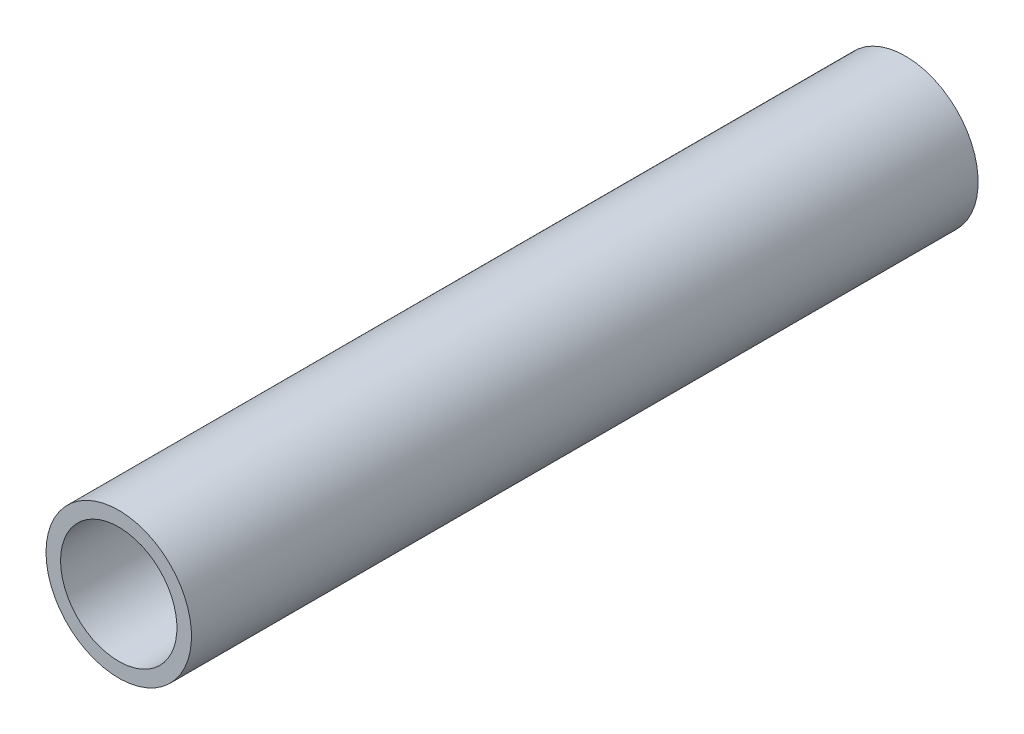
ISO-10303-21;
HEADER;
FILE_DESCRIPTION(('STEP AP214'),'2;1');
FILE_NAME('part.step','',(''),(''),'','','');
FILE_SCHEMA(('AUTOMOTIVE_DESIGN { 1 0 10303 214 1 1 1 1 }'));
ENDSEC;
DATA;
#1=APPLICATION_CONTEXT('core data for automotive mechanical design processes');
#2=APPLICATION_PROTOCOL_DEFINITION('international standard','automotive_design',2000,#1);
#3=PRODUCT_CONTEXT('',#1,'mechanical');
#4=PRODUCT('Part','Part','',(#3));
#5=PRODUCT_RELATED_PRODUCT_CATEGORY('part','',(#4));
#6=PRODUCT_DEFINITION_FORMATION('','',#4);
#7=PRODUCT_DEFINITION_CONTEXT('part definition',#1,'design');
#8=PRODUCT_DEFINITION('design','',#6,#7);
#9=PRODUCT_DEFINITION_SHAPE('','',#8);
#10=(LENGTH_UNIT() NAMED_UNIT(*) SI_UNIT(.MILLI.,.METRE.));
#11=(NAMED_UNIT(*) PLANE_ANGLE_UNIT() SI_UNIT($,.RADIAN.));
#12=(NAMED_UNIT(*) SI_UNIT($,.STERADIAN.) SOLID_ANGLE_UNIT());
#13=UNCERTAINTY_MEASURE_WITH_UNIT(LENGTH_MEASURE(1.E-05),#10,'distance_accuracy_value','');
#14=(GEOMETRIC_REPRESENTATION_CONTEXT(3) GLOBAL_UNCERTAINTY_ASSIGNED_CONTEXT((#13)) GLOBAL_UNIT_ASSIGNED_CONTEXT((#10,
#11,#12)) REPRESENTATION_CONTEXT('',''));
#15=CARTESIAN_POINT('',(0.,0.,0.));
#16=DIRECTION('',(0.,0.,1.));
#17=DIRECTION('',(1.,0.,0.));
#18=AXIS2_PLACEMENT_3D('',#15,#16,#17);
#19=CARTESIAN_POINT('',(0.,0.,13.52));
#20=DIRECTION('',(0.,0.,1.));
#21=DIRECTION('',(1.,0.,0.));
#22=AXIS2_PLACEMENT_3D('',#19,#20,#21);
#23=PLANE('',#22);
#24=CARTESIAN_POINT('',(0.,0.,13.52));
#25=DIRECTION('',(0.,0.,1.));
#26=DIRECTION('',(1.,0.,0.));
#27=AXIS2_PLACEMENT_3D('',#24,#25,#26);
#28=CIRCLE('',#27,1.25);
#29=CARTESIAN_POINT('',(-1.25,0.,13.52));
#30=VERTEX_POINT('',#29);
#31=EDGE_CURVE('E10',#30,#30,#28,.T.);
#32=ORIENTED_EDGE('',*,*,#31,.T.);
#33=EDGE_LOOP('',(#32));
#34=FACE_BOUND('',#33,.T.);
#35=CARTESIAN_POINT('',(0.,0.,13.52));
#36=DIRECTION('',(0.,0.,1.));
#37=DIRECTION('',(1.,0.,0.));
#38=AXIS2_PLACEMENT_3D('',#35,#36,#37);
#39=CIRCLE('',#38,1.);
#40=CARTESIAN_POINT('',(-1.,0.,13.52));
#41=VERTEX_POINT('',#40);
#42=EDGE_CURVE('E41',#41,#41,#39,.T.);
#43=ORIENTED_EDGE('',*,*,#42,.F.);
#44=EDGE_LOOP('',(#43));
#45=FACE_BOUND('',#44,.T.);
#46=ADVANCED_FACE('F30',(#34,#45),#23,.T.);
#47=CARTESIAN_POINT('',(0.,0.,0.));
#48=DIRECTION('',(0.,0.,1.));
#49=DIRECTION('',(1.,0.,0.));
#50=AXIS2_PLACEMENT_3D('',#47,#48,#49);
#51=PLANE('',#50);
#52=CARTESIAN_POINT('',(0.,0.,0.));
#53=DIRECTION('',(0.,0.,1.));
#54=DIRECTION('',(1.,0.,0.));
#55=AXIS2_PLACEMENT_3D('',#52,#53,#54);
#56=CIRCLE('',#55,1.25);
#57=CARTESIAN_POINT('',(-1.25,0.,0.));
#58=VERTEX_POINT('',#57);
#59=EDGE_CURVE('E34',#58,#58,#56,.T.);
#60=ORIENTED_EDGE('',*,*,#59,.F.);
#61=EDGE_LOOP('',(#60));
#62=FACE_BOUND('',#61,.T.);
#63=CARTESIAN_POINT('',(0.,0.,0.));
#64=DIRECTION('',(0.,0.,1.));
#65=DIRECTION('',(1.,0.,0.));
#66=AXIS2_PLACEMENT_3D('',#63,#64,#65);
#67=CIRCLE('',#66,1.);
#68=CARTESIAN_POINT('',(-1.,0.,0.));
#69=VERTEX_POINT('',#68);
#70=EDGE_CURVE('E43',#69,#69,#67,.T.);
#71=ORIENTED_EDGE('',*,*,#70,.T.);
#72=EDGE_LOOP('',(#71));
#73=FACE_BOUND('',#72,.T.);
#74=ADVANCED_FACE('F53',(#62,#73),#51,.F.);
#75=CARTESIAN_POINT('',(0.,0.,13.52));
#76=DIRECTION('',(0.,0.,-1.));
#77=DIRECTION('',(-1.,0.,0.));
#78=AXIS2_PLACEMENT_3D('',#75,#76,#77);
#79=CYLINDRICAL_SURFACE('',#78,1.25);
#80=CARTESIAN_POINT('',(-1.25,0.,13.52));
#81=CARTESIAN_POINT('',(-1.25,0.,13.3791666666667));
#82=CARTESIAN_POINT('',(-1.25,0.,13.2383333333333));
#83=CARTESIAN_POINT('',(-1.25,0.,12.9566666666667));
#84=CARTESIAN_POINT('',(-1.25,0.,12.8158333333333));
#85=CARTESIAN_POINT('',(-1.25,0.,12.5341666666667));
#86=CARTESIAN_POINT('',(-1.25,0.,12.3933333333333));
#87=CARTESIAN_POINT('',(-1.25,0.,12.1116666666667));
#88=CARTESIAN_POINT('',(-1.25,0.,11.9708333333333));
#89=CARTESIAN_POINT('',(-1.25,0.,11.6891666666667));
#90=CARTESIAN_POINT('',(-1.25,0.,11.5483333333333));
#91=CARTESIAN_POINT('',(-1.25,0.,11.2666666666667));
#92=CARTESIAN_POINT('',(-1.25,0.,11.1258333333333));
#93=CARTESIAN_POINT('',(-1.25,0.,10.8441666666667));
#94=CARTESIAN_POINT('',(-1.25,0.,10.7033333333333));
#95=CARTESIAN_POINT('',(-1.25,0.,10.4216666666667));
#96=CARTESIAN_POINT('',(-1.25,0.,10.2808333333333));
#97=CARTESIAN_POINT('',(-1.25,0.,9.99916666666667));
#98=CARTESIAN_POINT('',(-1.25,0.,9.85833333333333));
#99=CARTESIAN_POINT('',(-1.25,0.,9.57666666666667));
#100=CARTESIAN_POINT('',(-1.25,0.,9.43583333333333));
#101=CARTESIAN_POINT('',(-1.25,0.,9.15416666666667));
#102=CARTESIAN_POINT('',(-1.25,0.,9.01333333333333));
#103=CARTESIAN_POINT('',(-1.25,0.,8.73166666666667));
#104=CARTESIAN_POINT('',(-1.25,0.,8.59083333333333));
#105=CARTESIAN_POINT('',(-1.25,0.,8.30916666666667));
#106=CARTESIAN_POINT('',(-1.25,0.,8.16833333333333));
#107=CARTESIAN_POINT('',(-1.25,0.,7.88666666666667));
#108=CARTESIAN_POINT('',(-1.25,0.,7.74583333333333));
#109=CARTESIAN_POINT('',(-1.25,0.,7.46416666666667));
#110=CARTESIAN_POINT('',(-1.25,0.,7.32333333333333));
#111=CARTESIAN_POINT('',(-1.25,0.,7.04166666666667));
#112=CARTESIAN_POINT('',(-1.25,0.,6.90083333333333));
#113=CARTESIAN_POINT('',(-1.25,0.,6.61916666666667));
#114=CARTESIAN_POINT('',(-1.25,0.,6.47833333333333));
#115=CARTESIAN_POINT('',(-1.25,0.,6.19666666666667));
#116=CARTESIAN_POINT('',(-1.25,0.,6.05583333333333));
#117=CARTESIAN_POINT('',(-1.25,0.,5.77416666666667));
#118=CARTESIAN_POINT('',(-1.25,0.,5.63333333333333));
#119=CARTESIAN_POINT('',(-1.25,0.,5.35166666666667));
#120=CARTESIAN_POINT('',(-1.25,0.,5.21083333333333));
#121=CARTESIAN_POINT('',(-1.25,0.,4.92916666666667));
#122=CARTESIAN_POINT('',(-1.25,0.,4.78833333333333));
#123=CARTESIAN_POINT('',(-1.25,0.,4.50666666666667));
#124=CARTESIAN_POINT('',(-1.25,0.,4.36583333333333));
#125=CARTESIAN_POINT('',(-1.25,0.,4.08416666666667));
#126=CARTESIAN_POINT('',(-1.25,0.,3.94333333333333));
#127=CARTESIAN_POINT('',(-1.25,0.,3.66166666666667));
#128=CARTESIAN_POINT('',(-1.25,0.,3.52083333333333));
#129=CARTESIAN_POINT('',(-1.25,0.,3.23916666666667));
#130=CARTESIAN_POINT('',(-1.25,0.,3.09833333333333));
#131=CARTESIAN_POINT('',(-1.25,0.,2.81666666666667));
#132=CARTESIAN_POINT('',(-1.25,0.,2.67583333333333));
#133=CARTESIAN_POINT('',(-1.25,0.,2.39416666666667));
#134=CARTESIAN_POINT('',(-1.25,0.,2.25333333333333));
#135=CARTESIAN_POINT('',(-1.25,0.,1.97166666666667));
#136=CARTESIAN_POINT('',(-1.25,0.,1.83083333333333));
#137=CARTESIAN_POINT('',(-1.25,0.,1.54916666666667));
#138=CARTESIAN_POINT('',(-1.25,0.,1.40833333333333));
#139=CARTESIAN_POINT('',(-1.25,0.,1.12666666666667));
#140=CARTESIAN_POINT('',(-1.25,0.,0.985833333333333));
#141=CARTESIAN_POINT('',(-1.25,0.,0.704166666666667));
#142=CARTESIAN_POINT('',(-1.25,0.,0.563333333333333));
#143=CARTESIAN_POINT('',(-1.25,0.,0.281666666666666));
#144=CARTESIAN_POINT('',(-1.25,0.,0.140833333333333));
#145=CARTESIAN_POINT('',(-1.25,0.,0.));
#146=B_SPLINE_CURVE_WITH_KNOTS('',3,(#80,#81,#82,#83,#84,#85,#86,#87,#88,#89,#90,#91,#92,#93,
#94,#95,#96,#97,#98,#99,#100,#101,#102,#103,#104,#105,#106,#107,#108,#109,#110,#111,#112,#113,
#114,#115,#116,#117,#118,#119,#120,#121,#122,#123,#124,#125,#126,#127,#128,#129,#130,#131,#132,
#133,#134,#135,#136,#137,#138,#139,#140,#141,#142,#143,#144,#145),.UNSPECIFIED.,.F.,.F.,(4,2,2,
2,2,2,2,2,2,2,2,2,2,2,2,2,2,2,2,2,2,2,2,2,2,2,2,2,2,2,2,2,4),(0.,0.422499999999999,
0.844999999999999,1.2675,1.69,2.1125,2.535,2.9575,3.38,3.8025,4.225,4.6475,5.07,5.4925,5.915,
6.3375,6.76,7.1825,7.605,8.0275,8.45,8.8725,9.295,9.7175,10.14,10.5625,10.985,11.4075,11.83,
12.2525,12.675,13.0975,13.52),.UNSPECIFIED.);
#147=EDGE_CURVE('BSEAM32',#30,#58,#146,.T.);
#148=ORIENTED_EDGE('',*,*,#31,.F.);
#149=ORIENTED_EDGE('',*,*,#59,.T.);
#150=ORIENTED_EDGE('',*,*,#147,.T.);
#151=ORIENTED_EDGE('',*,*,#147,.F.);
#152=EDGE_LOOP('',(#148,#150,#149,#151));
#153=FACE_BOUND('',#152,.T.);
#154=ADVANCED_FACE('F32',(#153),#79,.T.);
#155=CARTESIAN_POINT('',(0.,0.,13.52));
#156=DIRECTION('',(0.,0.,-1.));
#157=DIRECTION('',(-1.,0.,0.));
#158=AXIS2_PLACEMENT_3D('',#155,#156,#157);
#159=CYLINDRICAL_SURFACE('',#158,1.);
#160=CARTESIAN_POINT('',(-1.,0.,13.52));
#161=CARTESIAN_POINT('',(-1.,0.,13.3791666666667));
#162=CARTESIAN_POINT('',(-1.,0.,13.2383333333333));
#163=CARTESIAN_POINT('',(-1.,0.,12.9566666666667));
#164=CARTESIAN_POINT('',(-1.,0.,12.8158333333333));
#165=CARTESIAN_POINT('',(-1.,0.,12.5341666666667));
#166=CARTESIAN_POINT('',(-1.,0.,12.3933333333333));
#167=CARTESIAN_POINT('',(-1.,0.,12.1116666666667));
#168=CARTESIAN_POINT('',(-1.,0.,11.9708333333333));
#169=CARTESIAN_POINT('',(-1.,0.,11.6891666666667));
#170=CARTESIAN_POINT('',(-1.,0.,11.5483333333333));
#171=CARTESIAN_POINT('',(-1.,0.,11.2666666666667));
#172=CARTESIAN_POINT('',(-1.,0.,11.1258333333333));
#173=CARTESIAN_POINT('',(-1.,0.,10.8441666666667));
#174=CARTESIAN_POINT('',(-1.,0.,10.7033333333333));
#175=CARTESIAN_POINT('',(-1.,0.,10.4216666666667));
#176=CARTESIAN_POINT('',(-1.,0.,10.2808333333333));
#177=CARTESIAN_POINT('',(-1.,0.,9.99916666666667));
#178=CARTESIAN_POINT('',(-1.,0.,9.85833333333333));
#179=CARTESIAN_POINT('',(-1.,0.,9.57666666666667));
#180=CARTESIAN_POINT('',(-1.,0.,9.43583333333333));
#181=CARTESIAN_POINT('',(-1.,0.,9.15416666666667));
#182=CARTESIAN_POINT('',(-1.,0.,9.01333333333333));
#183=CARTESIAN_POINT('',(-1.,0.,8.73166666666667));
#184=CARTESIAN_POINT('',(-1.,0.,8.59083333333333));
#185=CARTESIAN_POINT('',(-1.,0.,8.30916666666667));
#186=CARTESIAN_POINT('',(-1.,0.,8.16833333333333));
#187=CARTESIAN_POINT('',(-1.,0.,7.88666666666667));
#188=CARTESIAN_POINT('',(-1.,0.,7.74583333333333));
#189=CARTESIAN_POINT('',(-1.,0.,7.46416666666667));
#190=CARTESIAN_POINT('',(-1.,0.,7.32333333333333));
#191=CARTESIAN_POINT('',(-1.,0.,7.04166666666667));
#192=CARTESIAN_POINT('',(-1.,0.,6.90083333333333));
#193=CARTESIAN_POINT('',(-1.,0.,6.61916666666667));
#194=CARTESIAN_POINT('',(-1.,0.,6.47833333333333));
#195=CARTESIAN_POINT('',(-1.,0.,6.19666666666667));
#196=CARTESIAN_POINT('',(-1.,0.,6.05583333333333));
#197=CARTESIAN_POINT('',(-1.,0.,5.77416666666667));
#198=CARTESIAN_POINT('',(-1.,0.,5.63333333333333));
#199=CARTESIAN_POINT('',(-1.,0.,5.35166666666667));
#200=CARTESIAN_POINT('',(-1.,0.,5.21083333333333));
#201=CARTESIAN_POINT('',(-1.,0.,4.92916666666667));
#202=CARTESIAN_POINT('',(-1.,0.,4.78833333333333));
#203=CARTESIAN_POINT('',(-1.,0.,4.50666666666667));
#204=CARTESIAN_POINT('',(-1.,0.,4.36583333333333));
#205=CARTESIAN_POINT('',(-1.,0.,4.08416666666667));
#206=CARTESIAN_POINT('',(-1.,0.,3.94333333333333));
#207=CARTESIAN_POINT('',(-1.,0.,3.66166666666667));
#208=CARTESIAN_POINT('',(-1.,0.,3.52083333333333));
#209=CARTESIAN_POINT('',(-1.,0.,3.23916666666667));
#210=CARTESIAN_POINT('',(-1.,0.,3.09833333333333));
#211=CARTESIAN_POINT('',(-1.,0.,2.81666666666667));
#212=CARTESIAN_POINT('',(-1.,0.,2.67583333333333));
#213=CARTESIAN_POINT('',(-1.,0.,2.39416666666667));
#214=CARTESIAN_POINT('',(-1.,0.,2.25333333333333));
#215=CARTESIAN_POINT('',(-1.,0.,1.97166666666667));
#216=CARTESIAN_POINT('',(-1.,0.,1.83083333333333));
#217=CARTESIAN_POINT('',(-1.,0.,1.54916666666667));
#218=CARTESIAN_POINT('',(-1.,0.,1.40833333333333));
#219=CARTESIAN_POINT('',(-1.,0.,1.12666666666667));
#220=CARTESIAN_POINT('',(-1.,0.,0.985833333333333));
#221=CARTESIAN_POINT('',(-1.,0.,0.704166666666667));
#222=CARTESIAN_POINT('',(-1.,0.,0.563333333333333));
#223=CARTESIAN_POINT('',(-1.,0.,0.281666666666666));
#224=CARTESIAN_POINT('',(-1.,0.,0.140833333333333));
#225=CARTESIAN_POINT('',(-1.,0.,0.));
#226=B_SPLINE_CURVE_WITH_KNOTS('',3,(#160,#161,#162,#163,#164,#165,#166,#167,#168,#169,#170,
#171,#172,#173,#174,#175,#176,#177,#178,#179,#180,#181,#182,#183,#184,#185,#186,#187,#188,#189,
#190,#191,#192,#193,#194,#195,#196,#197,#198,#199,#200,#201,#202,#203,#204,#205,#206,#207,#208,
#209,#210,#211,#212,#213,#214,#215,#216,#217,#218,#219,#220,#221,#222,#223,#224,#225),
.UNSPECIFIED.,.F.,.F.,(4,2,2,2,2,2,2,2,2,2,2,2,2,2,2,2,2,2,2,2,2,2,2,2,2,2,2,2,2,2,2,2,4),(0.,
0.422499999999999,0.844999999999999,1.2675,1.69,2.1125,2.535,2.9575,3.38,3.8025,4.225,4.6475,
5.07,5.4925,5.915,6.3375,6.76,7.1825,7.605,8.0275,8.45,8.8725,9.295,9.7175,10.14,10.5625,10.985,
11.4075,11.83,12.2525,12.675,13.0975,13.52),.UNSPECIFIED.);
#227=EDGE_CURVE('BSEAM49',#41,#69,#226,.T.);
#228=ORIENTED_EDGE('',*,*,#42,.T.);
#229=ORIENTED_EDGE('',*,*,#70,.F.);
#230=ORIENTED_EDGE('',*,*,#227,.T.);
#231=ORIENTED_EDGE('',*,*,#227,.F.);
#232=EDGE_LOOP('',(#228,#230,#229,#231));
#233=FACE_BOUND('',#232,.T.);
#234=ADVANCED_FACE('F49',(#233),#159,.F.);
#235=CLOSED_SHELL('',(#46,#74,#154,#234));
#236=MANIFOLD_SOLID_BREP('B2',#235);
#237=ADVANCED_BREP_SHAPE_REPRESENTATION('',(#18,#236),#14);
#238=SHAPE_DEFINITION_REPRESENTATION(#9,#237);
ENDSEC;
END-ISO-10303-21;
